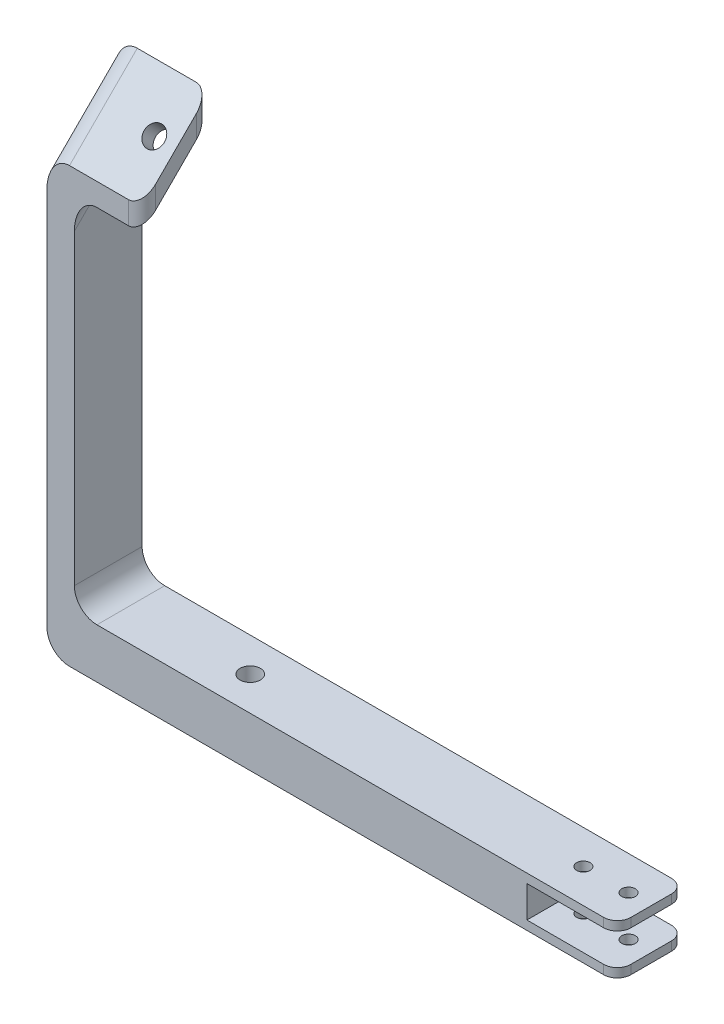
ISO-10303-21;
HEADER;
FILE_DESCRIPTION(('STEP AP214'),'2;1');
FILE_NAME('part.step','',(''),(''),'','','');
FILE_SCHEMA(('AUTOMOTIVE_DESIGN { 1 0 10303 214 1 1 1 1 }'));
ENDSEC;
DATA;
#1=APPLICATION_CONTEXT('core data for automotive mechanical design processes');
#2=APPLICATION_PROTOCOL_DEFINITION('international standard','automotive_design',2000,#1);
#3=PRODUCT_CONTEXT('',#1,'mechanical');
#4=PRODUCT('Part','Part','',(#3));
#5=PRODUCT_RELATED_PRODUCT_CATEGORY('part','',(#4));
#6=PRODUCT_DEFINITION_FORMATION('','',#4);
#7=PRODUCT_DEFINITION_CONTEXT('part definition',#1,'design');
#8=PRODUCT_DEFINITION('design','',#6,#7);
#9=PRODUCT_DEFINITION_SHAPE('','',#8);
#10=(LENGTH_UNIT() NAMED_UNIT(*) SI_UNIT(.MILLI.,.METRE.));
#11=(NAMED_UNIT(*) PLANE_ANGLE_UNIT() SI_UNIT($,.RADIAN.));
#12=(NAMED_UNIT(*) SI_UNIT($,.STERADIAN.) SOLID_ANGLE_UNIT());
#13=UNCERTAINTY_MEASURE_WITH_UNIT(LENGTH_MEASURE(1.E-05),#10,'distance_accuracy_value','');
#14=(GEOMETRIC_REPRESENTATION_CONTEXT(3) GLOBAL_UNCERTAINTY_ASSIGNED_CONTEXT((#13)) GLOBAL_UNIT_ASSIGNED_CONTEXT((#10,
#11,#12)) REPRESENTATION_CONTEXT('',''));
#15=CARTESIAN_POINT('',(0.,0.,0.));
#16=DIRECTION('',(0.,0.,1.));
#17=DIRECTION('',(1.,0.,0.));
#18=AXIS2_PLACEMENT_3D('',#15,#16,#17);
#19=CARTESIAN_POINT('',(-85.18,85.5,7.5));
#20=DIRECTION('',(-1.,0.,0.));
#21=DIRECTION('',(0.,0.,1.));
#22=AXIS2_PLACEMENT_3D('',#19,#20,#21);
#23=PLANE('',#22);
#24=DIRECTION('',(0.,-0.707106781186549,0.707106781186546));
#25=VECTOR('',#24,1.);
#26=CARTESIAN_POINT('',(-85.18,85.5,7.5));
#27=LINE('',#26,#25);
#28=CARTESIAN_POINT('',(-85.18,97.5,-4.5));
#29=VERTEX_POINT('',#28);
#30=CARTESIAN_POINT('',(-85.18,88.5,4.5));
#31=VERTEX_POINT('',#30);
#32=EDGE_CURVE('E207',#29,#31,#27,.T.);
#33=ORIENTED_EDGE('',*,*,#32,.F.);
#34=DIRECTION('',(0.,1.,0.));
#35=VECTOR('',#34,1.);
#36=CARTESIAN_POINT('',(-85.18,105.5,-4.5));
#37=LINE('',#36,#35);
#38=CARTESIAN_POINT('',(-85.18,102.5,-4.5));
#39=VERTEX_POINT('',#38);
#40=EDGE_CURVE('E225',#29,#39,#37,.T.);
#41=ORIENTED_EDGE('',*,*,#40,.T.);
#42=DIRECTION('',(0.,0.707106781186549,-0.707106781186546));
#43=VECTOR('',#42,1.);
#44=CARTESIAN_POINT('',(-85.18,88.,10.));
#45=LINE('',#44,#43);
#46=CARTESIAN_POINT('',(-85.18,93.5,4.5));
#47=VERTEX_POINT('',#46);
#48=EDGE_CURVE('E201',#47,#39,#45,.T.);
#49=ORIENTED_EDGE('',*,*,#48,.F.);
#50=DIRECTION('',(0.,1.,0.));
#51=VECTOR('',#50,1.);
#52=CARTESIAN_POINT('',(-85.18,85.5,4.5));
#53=LINE('',#52,#51);
#54=EDGE_CURVE('E233',#47,#31,#53,.F.);
#55=ORIENTED_EDGE('',*,*,#54,.T.);
#56=EDGE_LOOP('',(#33,#41,#49,#55));
#57=FACE_BOUND('',#56,.T.);
#58=ADVANCED_FACE('F43',(#57),#23,.F.);
#59=CARTESIAN_POINT('',(0.,0.,7.5));
#60=DIRECTION('',(0.,0.,-1.));
#61=DIRECTION('',(-1.,0.,0.));
#62=AXIS2_PLACEMENT_3D('',#59,#60,#61);
#63=PLANE('',#62);
#64=DIRECTION('',(-1.,0.,0.));
#65=VECTOR('',#64,1.);
#66=CARTESIAN_POINT('',(20.,90.5,7.5));
#67=LINE('',#66,#65);
#68=CARTESIAN_POINT('',(-88.18,90.5,7.5));
#69=VERTEX_POINT('',#68);
#70=CARTESIAN_POINT('',(-101.25,90.5,7.5));
#71=VERTEX_POINT('',#70);
#72=EDGE_CURVE('E540',#69,#71,#67,.T.);
#73=ORIENTED_EDGE('',*,*,#72,.T.);
#74=CARTESIAN_POINT('',(-101.25,83.4289321881345,7.5));
#75=DIRECTION('',(0.,0.,-1.));
#76=DIRECTION('',(0.,-1.,0.));
#77=AXIS2_PLACEMENT_3D('',#74,#75,#76);
#78=ELLIPSE('',#77,7.07106781186549,5.);
#79=CARTESIAN_POINT('',(-106.25,83.4289321881345,7.5));
#80=VERTEX_POINT('',#79);
#81=EDGE_CURVE('E278',#71,#80,#78,.F.);
#82=ORIENTED_EDGE('',*,*,#81,.T.);
#83=DIRECTION('',(0.,-1.,0.));
#84=VECTOR('',#83,1.);
#85=CARTESIAN_POINT('',(-106.25,105.5,7.5));
#86=LINE('',#85,#84);
#87=CARTESIAN_POINT('',(-106.25,-0.499999999999973,7.5));
#88=VERTEX_POINT('',#87);
#89=EDGE_CURVE('E325',#80,#88,#86,.T.);
#90=ORIENTED_EDGE('',*,*,#89,.T.);
#91=CARTESIAN_POINT('',(-101.25,-0.499999999999997,7.5));
#92=DIRECTION('',(0.,0.,-1.));
#93=DIRECTION('',(-1.,0.,0.));
#94=AXIS2_PLACEMENT_3D('',#91,#92,#93);
#95=CIRCLE('',#94,5.);
#96=CARTESIAN_POINT('',(-101.25,-5.5,7.5));
#97=VERTEX_POINT('',#96);
#98=EDGE_CURVE('E67',#88,#97,#95,.F.);
#99=ORIENTED_EDGE('',*,*,#98,.T.);
#100=DIRECTION('',(1.,0.,0.));
#101=VECTOR('',#100,1.);
#102=CARTESIAN_POINT('',(-106.25,-5.5,7.5));
#103=LINE('',#102,#101);
#104=CARTESIAN_POINT('',(17.,-5.5,7.5));
#105=VERTEX_POINT('',#104);
#106=EDGE_CURVE('E333',#97,#105,#103,.T.);
#107=ORIENTED_EDGE('',*,*,#106,.T.);
#108=DIRECTION('',(0.,1.,0.));
#109=VECTOR('',#108,1.);
#110=CARTESIAN_POINT('',(17.,0.,7.5));
#111=LINE('',#110,#109);
#112=CARTESIAN_POINT('',(17.,-3.5,7.5));
#113=VERTEX_POINT('',#112);
#114=EDGE_CURVE('E381',#105,#113,#111,.T.);
#115=ORIENTED_EDGE('',*,*,#114,.T.);
#116=DIRECTION('',(-1.,0.,0.));
#117=VECTOR('',#116,1.);
#118=CARTESIAN_POINT('',(20.,-3.5,7.5));
#119=LINE('',#118,#117);
#120=CARTESIAN_POINT('',(0.,-3.5,7.5));
#121=VERTEX_POINT('',#120);
#122=EDGE_CURVE('E355',#113,#121,#119,.T.);
#123=ORIENTED_EDGE('',*,*,#122,.T.);
#124=DIRECTION('',(0.,1.,0.));
#125=VECTOR('',#124,1.);
#126=CARTESIAN_POINT('',(0.,-3.5,7.5));
#127=LINE('',#126,#125);
#128=CARTESIAN_POINT('',(0.,3.5,7.5));
#129=VERTEX_POINT('',#128);
#130=EDGE_CURVE('E483',#121,#129,#127,.T.);
#131=ORIENTED_EDGE('',*,*,#130,.T.);
#132=DIRECTION('',(1.,0.,0.));
#133=VECTOR('',#132,1.);
#134=CARTESIAN_POINT('',(0.,3.5,7.5));
#135=LINE('',#134,#133);
#136=CARTESIAN_POINT('',(17.,3.5,7.5));
#137=VERTEX_POINT('',#136);
#138=EDGE_CURVE('E327',#129,#137,#135,.T.);
#139=ORIENTED_EDGE('',*,*,#138,.T.);
#140=DIRECTION('',(0.,1.,0.));
#141=VECTOR('',#140,1.);
#142=CARTESIAN_POINT('',(17.,0.,7.5));
#143=LINE('',#142,#141);
#144=CARTESIAN_POINT('',(17.,5.5,7.5));
#145=VERTEX_POINT('',#144);
#146=EDGE_CURVE('E378',#137,#145,#143,.T.);
#147=ORIENTED_EDGE('',*,*,#146,.T.);
#148=DIRECTION('',(-1.,0.,0.));
#149=VECTOR('',#148,1.);
#150=CARTESIAN_POINT('',(20.,5.5,7.5));
#151=LINE('',#150,#149);
#152=CARTESIAN_POINT('',(-95.18,5.49999999999999,7.5));
#153=VERTEX_POINT('',#152);
#154=EDGE_CURVE('E315',#145,#153,#151,.T.);
#155=ORIENTED_EDGE('',*,*,#154,.T.);
#156=CARTESIAN_POINT('',(-95.18,10.5,7.5));
#157=DIRECTION('',(0.,0.,-1.));
#158=DIRECTION('',(-1.,0.,0.));
#159=AXIS2_PLACEMENT_3D('',#156,#157,#158);
#160=CIRCLE('',#159,5.);
#161=CARTESIAN_POINT('',(-100.18,10.5,7.5));
#162=VERTEX_POINT('',#161);
#163=EDGE_CURVE('E12',#153,#162,#160,.T.);
#164=ORIENTED_EDGE('',*,*,#163,.T.);
#165=DIRECTION('',(0.,1.,0.));
#166=VECTOR('',#165,1.);
#167=CARTESIAN_POINT('',(-100.18,5.49999999999998,7.5));
#168=LINE('',#167,#166);
#169=CARTESIAN_POINT('',(-100.18,78.4289321881345,7.5));
#170=VERTEX_POINT('',#169);
#171=EDGE_CURVE('E313',#162,#170,#168,.T.);
#172=ORIENTED_EDGE('',*,*,#171,.T.);
#173=CARTESIAN_POINT('',(-95.18,78.4289321881345,7.5));
#174=DIRECTION('',(0.,0.,-1.));
#175=DIRECTION('',(0.,-1.,0.));
#176=AXIS2_PLACEMENT_3D('',#173,#174,#175);
#177=ELLIPSE('',#176,7.07106781186549,5.);
#178=CARTESIAN_POINT('',(-95.18,85.5,7.5));
#179=VERTEX_POINT('',#178);
#180=EDGE_CURVE('E287',#170,#179,#177,.T.);
#181=ORIENTED_EDGE('',*,*,#180,.T.);
#182=DIRECTION('',(1.,0.,0.));
#183=VECTOR('',#182,1.);
#184=CARTESIAN_POINT('',(-100.18,85.5,7.5));
#185=LINE('',#184,#183);
#186=CARTESIAN_POINT('',(-88.18,85.5,7.5));
#187=VERTEX_POINT('',#186);
#188=EDGE_CURVE('E320',#179,#187,#185,.T.);
#189=ORIENTED_EDGE('',*,*,#188,.T.);
#190=DIRECTION('',(0.,1.,0.));
#191=VECTOR('',#190,1.);
#192=CARTESIAN_POINT('',(-88.18,0.,7.5));
#193=LINE('',#192,#191);
#194=EDGE_CURVE('E224',#187,#69,#193,.T.);
#195=ORIENTED_EDGE('',*,*,#194,.T.);
#196=EDGE_LOOP('',(#73,#82,#90,#99,#107,#115,#123,#131,#139,#147,#155,#164,#172,#181,#189,#195));
#197=FACE_BOUND('',#196,.T.);
#198=ADVANCED_FACE('F312',(#197),#63,.F.);
#199=CARTESIAN_POINT('',(0.,0.,-7.5));
#200=DIRECTION('',(0.,0.,-1.));
#201=DIRECTION('',(-1.,0.,0.));
#202=AXIS2_PLACEMENT_3D('',#199,#200,#201);
#203=PLANE('',#202);
#204=DIRECTION('',(0.,-1.,0.));
#205=VECTOR('',#204,1.);
#206=CARTESIAN_POINT('',(-106.25,105.5,-7.5));
#207=LINE('',#206,#205);
#208=CARTESIAN_POINT('',(-106.25,98.4289321881346,-7.5));
#209=VERTEX_POINT('',#208);
#210=CARTESIAN_POINT('',(-106.25,-0.499999999999973,-7.5));
#211=VERTEX_POINT('',#210);
#212=EDGE_CURVE('E217',#209,#211,#207,.T.);
#213=ORIENTED_EDGE('',*,*,#212,.F.);
#214=CARTESIAN_POINT('',(-101.25,98.4289321881346,-7.5));
#215=DIRECTION('',(0.,0.,-1.));
#216=DIRECTION('',(0.,-1.,0.));
#217=AXIS2_PLACEMENT_3D('',#214,#215,#216);
#218=ELLIPSE('',#217,7.07106781186549,5.);
#219=CARTESIAN_POINT('',(-101.25,105.5,-7.5));
#220=VERTEX_POINT('',#219);
#221=EDGE_CURVE('E215',#209,#220,#218,.T.);
#222=ORIENTED_EDGE('',*,*,#221,.T.);
#223=DIRECTION('',(-1.,0.,0.));
#224=VECTOR('',#223,1.);
#225=CARTESIAN_POINT('',(-85.18,105.5,-7.5));
#226=LINE('',#225,#224);
#227=CARTESIAN_POINT('',(-88.18,105.5,-7.49999999999994));
#228=VERTEX_POINT('',#227);
#229=EDGE_CURVE('E198',#228,#220,#226,.T.);
#230=ORIENTED_EDGE('',*,*,#229,.F.);
#231=DIRECTION('',(0.,1.,0.));
#232=VECTOR('',#231,1.);
#233=CARTESIAN_POINT('',(-88.18,85.5,-7.5));
#234=LINE('',#233,#232);
#235=CARTESIAN_POINT('',(-88.18,100.5,-7.5));
#236=VERTEX_POINT('',#235);
#237=EDGE_CURVE('E214',#228,#236,#234,.F.);
#238=ORIENTED_EDGE('',*,*,#237,.T.);
#239=DIRECTION('',(-1.,0.,0.));
#240=VECTOR('',#239,1.);
#241=CARTESIAN_POINT('',(20.,100.5,-7.5));
#242=LINE('',#241,#240);
#243=CARTESIAN_POINT('',(-95.18,100.5,-7.5));
#244=VERTEX_POINT('',#243);
#245=EDGE_CURVE('E249',#236,#244,#242,.T.);
#246=ORIENTED_EDGE('',*,*,#245,.T.);
#247=CARTESIAN_POINT('',(-95.18,93.4289321881346,-7.5));
#248=DIRECTION('',(0.,0.,-1.));
#249=DIRECTION('',(0.,-1.,0.));
#250=AXIS2_PLACEMENT_3D('',#247,#248,#249);
#251=ELLIPSE('',#250,7.07106781186549,5.);
#252=CARTESIAN_POINT('',(-100.18,93.4289321881346,-7.5));
#253=VERTEX_POINT('',#252);
#254=EDGE_CURVE('E290',#244,#253,#251,.F.);
#255=ORIENTED_EDGE('',*,*,#254,.T.);
#256=DIRECTION('',(0.,1.,0.));
#257=VECTOR('',#256,1.);
#258=CARTESIAN_POINT('',(-100.18,5.49999999999998,-7.5));
#259=LINE('',#258,#257);
#260=CARTESIAN_POINT('',(-100.18,10.5,-7.5));
#261=VERTEX_POINT('',#260);
#262=EDGE_CURVE('E218',#261,#253,#259,.T.);
#263=ORIENTED_EDGE('',*,*,#262,.F.);
#264=CARTESIAN_POINT('',(-95.18,10.5,-7.5));
#265=DIRECTION('',(0.,0.,-1.));
#266=DIRECTION('',(-1.,0.,0.));
#267=AXIS2_PLACEMENT_3D('',#264,#265,#266);
#268=CIRCLE('',#267,5.);
#269=CARTESIAN_POINT('',(-95.18,5.49999999999999,-7.5));
#270=VERTEX_POINT('',#269);
#271=EDGE_CURVE('E52',#261,#270,#268,.F.);
#272=ORIENTED_EDGE('',*,*,#271,.T.);
#273=DIRECTION('',(-1.,0.,0.));
#274=VECTOR('',#273,1.);
#275=CARTESIAN_POINT('',(20.,5.5,-7.5));
#276=LINE('',#275,#274);
#277=CARTESIAN_POINT('',(17.,5.5,-7.5));
#278=VERTEX_POINT('',#277);
#279=EDGE_CURVE('E296',#278,#270,#276,.T.);
#280=ORIENTED_EDGE('',*,*,#279,.F.);
#281=DIRECTION('',(0.,1.,0.));
#282=VECTOR('',#281,1.);
#283=CARTESIAN_POINT('',(17.,3.5,-7.5));
#284=LINE('',#283,#282);
#285=CARTESIAN_POINT('',(17.,3.5,-7.5));
#286=VERTEX_POINT('',#285);
#287=EDGE_CURVE('E405',#278,#286,#284,.F.);
#288=ORIENTED_EDGE('',*,*,#287,.T.);
#289=DIRECTION('',(1.,0.,0.));
#290=VECTOR('',#289,1.);
#291=CARTESIAN_POINT('',(0.,3.5,-7.5));
#292=LINE('',#291,#290);
#293=CARTESIAN_POINT('',(0.,3.5,-7.5));
#294=VERTEX_POINT('',#293);
#295=EDGE_CURVE('E305',#294,#286,#292,.T.);
#296=ORIENTED_EDGE('',*,*,#295,.F.);
#297=DIRECTION('',(0.,1.,0.));
#298=VECTOR('',#297,1.);
#299=CARTESIAN_POINT('',(0.,-3.5,-7.5));
#300=LINE('',#299,#298);
#301=CARTESIAN_POINT('',(0.,-3.5,-7.5));
#302=VERTEX_POINT('',#301);
#303=EDGE_CURVE('E340',#302,#294,#300,.T.);
#304=ORIENTED_EDGE('',*,*,#303,.F.);
#305=DIRECTION('',(-1.,0.,0.));
#306=VECTOR('',#305,1.);
#307=CARTESIAN_POINT('',(20.,-3.5,-7.5));
#308=LINE('',#307,#306);
#309=CARTESIAN_POINT('',(17.,-3.5,-7.5));
#310=VERTEX_POINT('',#309);
#311=EDGE_CURVE('E337',#310,#302,#308,.T.);
#312=ORIENTED_EDGE('',*,*,#311,.F.);
#313=DIRECTION('',(0.,1.,0.));
#314=VECTOR('',#313,1.);
#315=CARTESIAN_POINT('',(17.,-5.5,-7.5));
#316=LINE('',#315,#314);
#317=CARTESIAN_POINT('',(17.,-5.5,-7.5));
#318=VERTEX_POINT('',#317);
#319=EDGE_CURVE('E408',#310,#318,#316,.F.);
#320=ORIENTED_EDGE('',*,*,#319,.T.);
#321=DIRECTION('',(1.,0.,0.));
#322=VECTOR('',#321,1.);
#323=CARTESIAN_POINT('',(-106.25,-5.5,-7.5));
#324=LINE('',#323,#322);
#325=CARTESIAN_POINT('',(-101.25,-5.5,-7.5));
#326=VERTEX_POINT('',#325);
#327=EDGE_CURVE('E352',#326,#318,#324,.T.);
#328=ORIENTED_EDGE('',*,*,#327,.F.);
#329=CARTESIAN_POINT('',(-101.25,-0.499999999999997,-7.5));
#330=DIRECTION('',(0.,0.,-1.));
#331=DIRECTION('',(-1.,0.,0.));
#332=AXIS2_PLACEMENT_3D('',#329,#330,#331);
#333=CIRCLE('',#332,5.);
#334=EDGE_CURVE('E268',#326,#211,#333,.T.);
#335=ORIENTED_EDGE('',*,*,#334,.T.);
#336=EDGE_LOOP('',(#213,#222,#230,#238,#246,#255,#263,#272,#280,#288,#296,#304,#312,#320,#328,#335));
#337=FACE_BOUND('',#336,.T.);
#338=ADVANCED_FACE('F212',(#337),#203,.T.);
#339=CARTESIAN_POINT('',(-88.18,85.5,-4.5));
#340=DIRECTION('',(0.,-1.,0.));
#341=DIRECTION('',(0.,0.,-1.));
#342=AXIS2_PLACEMENT_3D('',#339,#340,#341);
#343=CYLINDRICAL_SURFACE('',#342,3.);
#344=ORIENTED_EDGE('',*,*,#40,.F.);
#345=CARTESIAN_POINT('',(-88.18,97.5,-4.5));
#346=DIRECTION('',(0.,-0.707106781186546,-0.707106781186549));
#347=DIRECTION('',(0.,-0.707106781186549,0.707106781186546));
#348=AXIS2_PLACEMENT_3D('',#345,#346,#347);
#349=ELLIPSE('',#348,4.24264068711929,3.);
#350=EDGE_CURVE('E222',#29,#236,#349,.F.);
#351=ORIENTED_EDGE('',*,*,#350,.T.);
#352=ORIENTED_EDGE('',*,*,#237,.F.);
#353=CARTESIAN_POINT('',(-88.18,102.5,-4.5));
#354=DIRECTION('',(0.,0.707106781186546,0.707106781186549));
#355=DIRECTION('',(0.,-0.707106781186549,0.707106781186546));
#356=AXIS2_PLACEMENT_3D('',#353,#354,#355);
#357=ELLIPSE('',#356,4.24264068711929,3.);
#358=EDGE_CURVE('E195',#228,#39,#357,.F.);
#359=ORIENTED_EDGE('',*,*,#358,.T.);
#360=EDGE_LOOP('',(#344,#351,#352,#359));
#361=FACE_BOUND('',#360,.T.);
#362=ADVANCED_FACE('F221',(#361),#343,.T.);
#363=CARTESIAN_POINT('',(-88.18,0.,4.5));
#364=DIRECTION('',(0.,1.,0.));
#365=DIRECTION('',(0.,0.,1.));
#366=AXIS2_PLACEMENT_3D('',#363,#364,#365);
#367=CYLINDRICAL_SURFACE('',#366,3.);
#368=ORIENTED_EDGE('',*,*,#194,.F.);
#369=CARTESIAN_POINT('',(-88.18,88.5,4.5));
#370=DIRECTION('',(0.,-0.707106781186546,-0.707106781186549));
#371=DIRECTION('',(0.,0.707106781186549,-0.707106781186546));
#372=AXIS2_PLACEMENT_3D('',#369,#370,#371);
#373=ELLIPSE('',#372,4.24264068711929,3.);
#374=EDGE_CURVE('E240',#187,#31,#373,.F.);
#375=ORIENTED_EDGE('',*,*,#374,.T.);
#376=ORIENTED_EDGE('',*,*,#54,.F.);
#377=CARTESIAN_POINT('',(-88.18,93.5,4.5));
#378=DIRECTION('',(0.,0.707106781186546,0.707106781186549));
#379=DIRECTION('',(0.,0.707106781186549,-0.707106781186546));
#380=AXIS2_PLACEMENT_3D('',#377,#378,#379);
#381=ELLIPSE('',#380,4.24264068711929,3.);
#382=EDGE_CURVE('E231',#47,#69,#381,.F.);
#383=ORIENTED_EDGE('',*,*,#382,.T.);
#384=EDGE_LOOP('',(#368,#375,#376,#383));
#385=FACE_BOUND('',#384,.T.);
#386=ADVANCED_FACE('F437',(#385),#367,.T.);
#387=CARTESIAN_POINT('',(20.,-3.5,7.5));
#388=DIRECTION('',(0.,-1.,0.));
#389=DIRECTION('',(1.,0.,0.));
#390=AXIS2_PLACEMENT_3D('',#387,#388,#389);
#391=PLANE('',#390);
#392=CARTESIAN_POINT('',(15.,-3.5,0.));
#393=DIRECTION('',(0.,-1.,0.));
#394=DIRECTION('',(1.,0.,0.));
#395=AXIS2_PLACEMENT_3D('',#392,#393,#394);
#396=CIRCLE('',#395,1.5);
#397=CARTESIAN_POINT('',(16.5,-3.5,0.));
#398=VERTEX_POINT('',#397);
#399=EDGE_CURVE('E341',#398,#398,#396,.T.);
#400=ORIENTED_EDGE('',*,*,#399,.T.);
#401=EDGE_LOOP('',(#400));
#402=FACE_BOUND('',#401,.T.);
#403=CARTESIAN_POINT('',(5.,-3.5,0.));
#404=DIRECTION('',(0.,-1.,0.));
#405=DIRECTION('',(1.,0.,0.));
#406=AXIS2_PLACEMENT_3D('',#403,#404,#405);
#407=CIRCLE('',#406,1.5);
#408=CARTESIAN_POINT('',(6.5,-3.5,0.));
#409=VERTEX_POINT('',#408);
#410=EDGE_CURVE('E470',#409,#409,#407,.T.);
#411=ORIENTED_EDGE('',*,*,#410,.T.);
#412=EDGE_LOOP('',(#411));
#413=FACE_BOUND('',#412,.T.);
#414=ORIENTED_EDGE('',*,*,#122,.F.);
#415=CARTESIAN_POINT('',(17.,-3.5,4.5));
#416=DIRECTION('',(0.,-1.,0.));
#417=DIRECTION('',(1.,0.,0.));
#418=AXIS2_PLACEMENT_3D('',#415,#416,#417);
#419=CIRCLE('',#418,3.);
#420=CARTESIAN_POINT('',(20.,-3.5,4.5));
#421=VERTEX_POINT('',#420);
#422=EDGE_CURVE('E388',#113,#421,#419,.F.);
#423=ORIENTED_EDGE('',*,*,#422,.T.);
#424=DIRECTION('',(0.,0.,-1.));
#425=VECTOR('',#424,1.);
#426=CARTESIAN_POINT('',(20.,-3.5,7.5));
#427=LINE('',#426,#425);
#428=CARTESIAN_POINT('',(20.,-3.5,-4.5));
#429=VERTEX_POINT('',#428);
#430=EDGE_CURVE('E336',#421,#429,#427,.T.);
#431=ORIENTED_EDGE('',*,*,#430,.T.);
#432=CARTESIAN_POINT('',(17.,-3.5,-4.5));
#433=DIRECTION('',(0.,-1.,0.));
#434=DIRECTION('',(1.,0.,0.));
#435=AXIS2_PLACEMENT_3D('',#432,#433,#434);
#436=CIRCLE('',#435,3.);
#437=EDGE_CURVE('E385',#429,#310,#436,.F.);
#438=ORIENTED_EDGE('',*,*,#437,.T.);
#439=ORIENTED_EDGE('',*,*,#311,.T.);
#440=DIRECTION('',(0.,0.,-1.));
#441=VECTOR('',#440,1.);
#442=CARTESIAN_POINT('',(0.,-3.5,7.5));
#443=LINE('',#442,#441);
#444=EDGE_CURVE('E374',#121,#302,#443,.T.);
#445=ORIENTED_EDGE('',*,*,#444,.F.);
#446=EDGE_LOOP('',(#414,#423,#431,#438,#439,#445));
#447=FACE_BOUND('',#446,.T.);
#448=ADVANCED_FACE('F595',(#402,#413,#447),#391,.F.);
#449=CARTESIAN_POINT('',(0.,-3.5,7.5));
#450=DIRECTION('',(-1.,0.,0.));
#451=DIRECTION('',(0.,0.,1.));
#452=AXIS2_PLACEMENT_3D('',#449,#450,#451);
#453=PLANE('',#452);
#454=ORIENTED_EDGE('',*,*,#303,.T.);
#455=DIRECTION('',(0.,0.,-1.));
#456=VECTOR('',#455,1.);
#457=CARTESIAN_POINT('',(0.,3.5,7.5));
#458=LINE('',#457,#456);
#459=EDGE_CURVE('E370',#129,#294,#458,.T.);
#460=ORIENTED_EDGE('',*,*,#459,.F.);
#461=ORIENTED_EDGE('',*,*,#130,.F.);
#462=ORIENTED_EDGE('',*,*,#444,.T.);
#463=EDGE_LOOP('',(#454,#460,#461,#462));
#464=FACE_BOUND('',#463,.T.);
#465=ADVANCED_FACE('F509',(#464),#453,.F.);
#466=CARTESIAN_POINT('',(0.,3.5,7.5));
#467=DIRECTION('',(0.,1.,0.));
#468=DIRECTION('',(0.,0.,1.));
#469=AXIS2_PLACEMENT_3D('',#466,#467,#468);
#470=PLANE('',#469);
#471=CARTESIAN_POINT('',(15.,3.5,0.));
#472=DIRECTION('',(0.,1.,0.));
#473=DIRECTION('',(0.,0.,1.));
#474=AXIS2_PLACEMENT_3D('',#471,#472,#473);
#475=CIRCLE('',#474,1.5);
#476=CARTESIAN_POINT('',(15.,3.5,1.5));
#477=VERTEX_POINT('',#476);
#478=EDGE_CURVE('E474',#477,#477,#475,.T.);
#479=ORIENTED_EDGE('',*,*,#478,.T.);
#480=EDGE_LOOP('',(#479));
#481=FACE_BOUND('',#480,.T.);
#482=CARTESIAN_POINT('',(5.,3.5,0.));
#483=DIRECTION('',(0.,1.,0.));
#484=DIRECTION('',(0.,0.,1.));
#485=AXIS2_PLACEMENT_3D('',#482,#483,#484);
#486=CIRCLE('',#485,1.5);
#487=CARTESIAN_POINT('',(5.,3.5,1.5));
#488=VERTEX_POINT('',#487);
#489=EDGE_CURVE('E455',#488,#488,#486,.T.);
#490=ORIENTED_EDGE('',*,*,#489,.T.);
#491=EDGE_LOOP('',(#490));
#492=FACE_BOUND('',#491,.T.);
#493=DIRECTION('',(0.,0.,-1.));
#494=VECTOR('',#493,1.);
#495=CARTESIAN_POINT('',(20.,3.5,7.5));
#496=LINE('',#495,#494);
#497=CARTESIAN_POINT('',(20.,3.5,4.5));
#498=VERTEX_POINT('',#497);
#499=CARTESIAN_POINT('',(20.,3.5,-4.5));
#500=VERTEX_POINT('',#499);
#501=EDGE_CURVE('E366',#498,#500,#496,.T.);
#502=ORIENTED_EDGE('',*,*,#501,.F.);
#503=CARTESIAN_POINT('',(17.,3.5,4.5));
#504=DIRECTION('',(0.,1.,0.));
#505=DIRECTION('',(0.,0.,1.));
#506=AXIS2_PLACEMENT_3D('',#503,#504,#505);
#507=CIRCLE('',#506,3.);
#508=EDGE_CURVE('E427',#498,#137,#507,.F.);
#509=ORIENTED_EDGE('',*,*,#508,.T.);
#510=ORIENTED_EDGE('',*,*,#138,.F.);
#511=ORIENTED_EDGE('',*,*,#459,.T.);
#512=ORIENTED_EDGE('',*,*,#295,.T.);
#513=CARTESIAN_POINT('',(17.,3.5,-4.5));
#514=DIRECTION('',(0.,1.,0.));
#515=DIRECTION('',(0.,0.,1.));
#516=AXIS2_PLACEMENT_3D('',#513,#514,#515);
#517=CIRCLE('',#516,3.);
#518=EDGE_CURVE('E424',#286,#500,#517,.F.);
#519=ORIENTED_EDGE('',*,*,#518,.T.);
#520=EDGE_LOOP('',(#502,#509,#510,#511,#512,#519));
#521=FACE_BOUND('',#520,.T.);
#522=ADVANCED_FACE('F507',(#481,#492,#521),#470,.F.);
#523=CARTESIAN_POINT('',(20.,3.5,7.5));
#524=DIRECTION('',(-1.,0.,0.));
#525=DIRECTION('',(0.,-1.,0.));
#526=AXIS2_PLACEMENT_3D('',#523,#524,#525);
#527=PLANE('',#526);
#528=DIRECTION('',(0.,0.,-1.));
#529=VECTOR('',#528,1.);
#530=CARTESIAN_POINT('',(20.,5.5,7.5));
#531=LINE('',#530,#529);
#532=CARTESIAN_POINT('',(20.,5.5,4.5));
#533=VERTEX_POINT('',#532);
#534=CARTESIAN_POINT('',(20.,5.5,-4.5));
#535=VERTEX_POINT('',#534);
#536=EDGE_CURVE('E363',#533,#535,#531,.T.);
#537=ORIENTED_EDGE('',*,*,#536,.F.);
#538=DIRECTION('',(0.,1.,0.));
#539=VECTOR('',#538,1.);
#540=CARTESIAN_POINT('',(20.,3.5,4.5));
#541=LINE('',#540,#539);
#542=EDGE_CURVE('E421',#533,#498,#541,.F.);
#543=ORIENTED_EDGE('',*,*,#542,.T.);
#544=ORIENTED_EDGE('',*,*,#501,.T.);
#545=DIRECTION('',(0.,1.,0.));
#546=VECTOR('',#545,1.);
#547=CARTESIAN_POINT('',(20.,5.5,-4.5));
#548=LINE('',#547,#546);
#549=EDGE_CURVE('E417',#500,#535,#548,.T.);
#550=ORIENTED_EDGE('',*,*,#549,.T.);
#551=EDGE_LOOP('',(#537,#543,#544,#550));
#552=FACE_BOUND('',#551,.T.);
#553=ADVANCED_FACE('F499',(#552),#527,.F.);
#554=CARTESIAN_POINT('',(20.,5.5,7.5));
#555=DIRECTION('',(0.,-1.,0.));
#556=DIRECTION('',(1.,0.,0.));
#557=AXIS2_PLACEMENT_3D('',#554,#555,#556);
#558=PLANE('',#557);
#559=CARTESIAN_POINT('',(-68.75,5.49999999999999,0.));
#560=DIRECTION('',(0.,1.,0.));
#561=DIRECTION('',(-1.,0.,0.));
#562=AXIS2_PLACEMENT_3D('',#559,#560,#561);
#563=CIRCLE('',#562,2.25);
#564=CARTESIAN_POINT('',(-71.,5.49999999999999,0.));
#565=VERTEX_POINT('',#564);
#566=EDGE_CURVE('E552',#565,#565,#563,.T.);
#567=ORIENTED_EDGE('',*,*,#566,.F.);
#568=EDGE_LOOP('',(#567));
#569=FACE_BOUND('',#568,.T.);
#570=CARTESIAN_POINT('',(15.,5.5,0.));
#571=DIRECTION('',(0.,1.,0.));
#572=DIRECTION('',(-1.,0.,0.));
#573=AXIS2_PLACEMENT_3D('',#570,#571,#572);
#574=CIRCLE('',#573,1.5);
#575=CARTESIAN_POINT('',(13.5,5.5,0.));
#576=VERTEX_POINT('',#575);
#577=EDGE_CURVE('E456',#576,#576,#574,.T.);
#578=ORIENTED_EDGE('',*,*,#577,.F.);
#579=EDGE_LOOP('',(#578));
#580=FACE_BOUND('',#579,.T.);
#581=CARTESIAN_POINT('',(5.,5.5,0.));
#582=DIRECTION('',(0.,1.,0.));
#583=DIRECTION('',(-1.,0.,0.));
#584=AXIS2_PLACEMENT_3D('',#581,#582,#583);
#585=CIRCLE('',#584,1.5);
#586=CARTESIAN_POINT('',(3.5,5.5,0.));
#587=VERTEX_POINT('',#586);
#588=EDGE_CURVE('E460',#587,#587,#585,.T.);
#589=ORIENTED_EDGE('',*,*,#588,.F.);
#590=EDGE_LOOP('',(#589));
#591=FACE_BOUND('',#590,.T.);
#592=ORIENTED_EDGE('',*,*,#279,.T.);
#593=DIRECTION('',(0.,0.,-1.));
#594=VECTOR('',#593,1.);
#595=CARTESIAN_POINT('',(-95.18,5.49999999999999,7.5));
#596=LINE('',#595,#594);
#597=EDGE_CURVE('E59',#270,#153,#596,.F.);
#598=ORIENTED_EDGE('',*,*,#597,.T.);
#599=ORIENTED_EDGE('',*,*,#154,.F.);
#600=CARTESIAN_POINT('',(17.,5.5,4.5));
#601=DIRECTION('',(0.,-1.,0.));
#602=DIRECTION('',(1.,0.,0.));
#603=AXIS2_PLACEMENT_3D('',#600,#601,#602);
#604=CIRCLE('',#603,3.);
#605=EDGE_CURVE('E414',#145,#533,#604,.F.);
#606=ORIENTED_EDGE('',*,*,#605,.T.);
#607=ORIENTED_EDGE('',*,*,#536,.T.);
#608=CARTESIAN_POINT('',(17.,5.5,-4.5));
#609=DIRECTION('',(0.,-1.,0.));
#610=DIRECTION('',(1.,0.,0.));
#611=AXIS2_PLACEMENT_3D('',#608,#609,#610);
#612=CIRCLE('',#611,3.);
#613=EDGE_CURVE('E303',#535,#278,#612,.F.);
#614=ORIENTED_EDGE('',*,*,#613,.T.);
#615=EDGE_LOOP('',(#592,#598,#599,#606,#607,#614));
#616=FACE_BOUND('',#615,.T.);
#617=ADVANCED_FACE('F301',(#569,#580,#591,#616),#558,.F.);
#618=CARTESIAN_POINT('',(-100.18,5.49999999999998,7.5));
#619=DIRECTION('',(-1.,0.,0.));
#620=DIRECTION('',(0.,0.,1.));
#621=AXIS2_PLACEMENT_3D('',#618,#619,#620);
#622=PLANE('',#621);
#623=ORIENTED_EDGE('',*,*,#262,.T.);
#624=DIRECTION('',(0.,-0.707106781186549,0.707106781186546));
#625=VECTOR('',#624,1.);
#626=CARTESIAN_POINT('',(-100.18,41.9644660940671,43.9644660940672));
#627=LINE('',#626,#625);
#628=EDGE_CURVE('E254',#253,#170,#627,.T.);
#629=ORIENTED_EDGE('',*,*,#628,.T.);
#630=ORIENTED_EDGE('',*,*,#171,.F.);
#631=DIRECTION('',(0.,0.,-1.));
#632=VECTOR('',#631,1.);
#633=CARTESIAN_POINT('',(-100.18,10.5,-7.5));
#634=LINE('',#633,#632);
#635=EDGE_CURVE('E244',#162,#261,#634,.T.);
#636=ORIENTED_EDGE('',*,*,#635,.T.);
#637=EDGE_LOOP('',(#623,#629,#630,#636));
#638=FACE_BOUND('',#637,.T.);
#639=ADVANCED_FACE('F317',(#638),#622,.F.);
#640=CARTESIAN_POINT('',(-106.25,105.5,7.5));
#641=DIRECTION('',(1.,0.,0.));
#642=DIRECTION('',(0.,1.,0.));
#643=AXIS2_PLACEMENT_3D('',#640,#641,#642);
#644=PLANE('',#643);
#645=ORIENTED_EDGE('',*,*,#89,.F.);
#646=DIRECTION('',(0.,0.707106781186549,-0.707106781186546));
#647=VECTOR('',#646,1.);
#648=CARTESIAN_POINT('',(-106.25,101.964466094067,-11.0355339059327));
#649=LINE('',#648,#647);
#650=EDGE_CURVE('E264',#80,#209,#649,.T.);
#651=ORIENTED_EDGE('',*,*,#650,.T.);
#652=ORIENTED_EDGE('',*,*,#212,.T.);
#653=DIRECTION('',(0.,0.,-1.));
#654=VECTOR('',#653,1.);
#655=CARTESIAN_POINT('',(-106.25,-0.5,7.5));
#656=LINE('',#655,#654);
#657=EDGE_CURVE('E261',#211,#88,#656,.F.);
#658=ORIENTED_EDGE('',*,*,#657,.T.);
#659=EDGE_LOOP('',(#645,#651,#652,#658));
#660=FACE_BOUND('',#659,.T.);
#661=ADVANCED_FACE('F535',(#660),#644,.F.);
#662=CARTESIAN_POINT('',(-106.25,-5.5,7.5));
#663=DIRECTION('',(0.,1.,0.));
#664=DIRECTION('',(0.,0.,1.));
#665=AXIS2_PLACEMENT_3D('',#662,#663,#664);
#666=PLANE('',#665);
#667=CARTESIAN_POINT('',(15.,-5.5,0.));
#668=DIRECTION('',(0.,1.,0.));
#669=DIRECTION('',(-1.,0.,0.));
#670=AXIS2_PLACEMENT_3D('',#667,#668,#669);
#671=CIRCLE('',#670,1.5);
#672=CARTESIAN_POINT('',(13.5,-5.5,0.));
#673=VERTEX_POINT('',#672);
#674=EDGE_CURVE('E451',#673,#673,#671,.T.);
#675=ORIENTED_EDGE('',*,*,#674,.T.);
#676=EDGE_LOOP('',(#675));
#677=FACE_BOUND('',#676,.T.);
#678=CARTESIAN_POINT('',(5.,-5.5,0.));
#679=DIRECTION('',(0.,1.,0.));
#680=DIRECTION('',(-1.,0.,0.));
#681=AXIS2_PLACEMENT_3D('',#678,#679,#680);
#682=CIRCLE('',#681,1.5);
#683=CARTESIAN_POINT('',(3.5,-5.5,0.));
#684=VERTEX_POINT('',#683);
#685=EDGE_CURVE('E447',#684,#684,#682,.T.);
#686=ORIENTED_EDGE('',*,*,#685,.T.);
#687=EDGE_LOOP('',(#686));
#688=FACE_BOUND('',#687,.T.);
#689=ORIENTED_EDGE('',*,*,#106,.F.);
#690=DIRECTION('',(0.,0.,-1.));
#691=VECTOR('',#690,1.);
#692=CARTESIAN_POINT('',(-101.25,-5.5,7.5));
#693=LINE('',#692,#691);
#694=EDGE_CURVE('E283',#97,#326,#693,.T.);
#695=ORIENTED_EDGE('',*,*,#694,.T.);
#696=ORIENTED_EDGE('',*,*,#327,.T.);
#697=CARTESIAN_POINT('',(17.,-5.5,-4.5));
#698=DIRECTION('',(0.,1.,0.));
#699=DIRECTION('',(0.,0.,1.));
#700=AXIS2_PLACEMENT_3D('',#697,#698,#699);
#701=CIRCLE('',#700,3.);
#702=CARTESIAN_POINT('',(20.,-5.5,-4.5));
#703=VERTEX_POINT('',#702);
#704=EDGE_CURVE('E398',#318,#703,#701,.F.);
#705=ORIENTED_EDGE('',*,*,#704,.T.);
#706=DIRECTION('',(0.,0.,-1.));
#707=VECTOR('',#706,1.);
#708=CARTESIAN_POINT('',(20.,-5.5,7.5));
#709=LINE('',#708,#707);
#710=CARTESIAN_POINT('',(20.,-5.5,4.5));
#711=VERTEX_POINT('',#710);
#712=EDGE_CURVE('E359',#711,#703,#709,.T.);
#713=ORIENTED_EDGE('',*,*,#712,.F.);
#714=CARTESIAN_POINT('',(17.,-5.5,4.5));
#715=DIRECTION('',(0.,1.,0.));
#716=DIRECTION('',(0.,0.,1.));
#717=AXIS2_PLACEMENT_3D('',#714,#715,#716);
#718=CIRCLE('',#717,3.);
#719=EDGE_CURVE('E401',#711,#105,#718,.F.);
#720=ORIENTED_EDGE('',*,*,#719,.T.);
#721=EDGE_LOOP('',(#689,#695,#696,#705,#713,#720));
#722=FACE_BOUND('',#721,.T.);
#723=ADVANCED_FACE('F521',(#677,#688,#722),#666,.F.);
#724=CARTESIAN_POINT('',(20.,-5.5,7.5));
#725=DIRECTION('',(-1.,0.,0.));
#726=DIRECTION('',(0.,0.,1.));
#727=AXIS2_PLACEMENT_3D('',#724,#725,#726);
#728=PLANE('',#727);
#729=ORIENTED_EDGE('',*,*,#430,.F.);
#730=DIRECTION('',(0.,1.,0.));
#731=VECTOR('',#730,1.);
#732=CARTESIAN_POINT('',(20.,-5.5,4.5));
#733=LINE('',#732,#731);
#734=EDGE_CURVE('E395',#421,#711,#733,.F.);
#735=ORIENTED_EDGE('',*,*,#734,.T.);
#736=ORIENTED_EDGE('',*,*,#712,.T.);
#737=DIRECTION('',(0.,1.,0.));
#738=VECTOR('',#737,1.);
#739=CARTESIAN_POINT('',(20.,-3.5,-4.5));
#740=LINE('',#739,#738);
#741=EDGE_CURVE('E391',#703,#429,#740,.T.);
#742=ORIENTED_EDGE('',*,*,#741,.T.);
#743=EDGE_LOOP('',(#729,#735,#736,#742));
#744=FACE_BOUND('',#743,.T.);
#745=ADVANCED_FACE('F525',(#744),#728,.F.);
#746=CARTESIAN_POINT('',(5.,-5.5,0.));
#747=DIRECTION('',(0.,1.,0.));
#748=DIRECTION('',(-1.,0.,0.));
#749=AXIS2_PLACEMENT_3D('',#746,#747,#748);
#750=CYLINDRICAL_SURFACE('',#749,1.5);
#751=ORIENTED_EDGE('',*,*,#685,.F.);
#752=EDGE_LOOP('',(#751));
#753=FACE_BOUND('',#752,.T.);
#754=ORIENTED_EDGE('',*,*,#410,.F.);
#755=EDGE_LOOP('',(#754));
#756=FACE_BOUND('',#755,.T.);
#757=ADVANCED_FACE('F583',(#753,#756),#750,.F.);
#758=CARTESIAN_POINT('',(15.,-5.5,0.));
#759=DIRECTION('',(0.,1.,0.));
#760=DIRECTION('',(-1.,0.,0.));
#761=AXIS2_PLACEMENT_3D('',#758,#759,#760);
#762=CYLINDRICAL_SURFACE('',#761,1.5);
#763=ORIENTED_EDGE('',*,*,#674,.F.);
#764=EDGE_LOOP('',(#763));
#765=FACE_BOUND('',#764,.T.);
#766=ORIENTED_EDGE('',*,*,#399,.F.);
#767=EDGE_LOOP('',(#766));
#768=FACE_BOUND('',#767,.T.);
#769=ADVANCED_FACE('F581',(#765,#768),#762,.F.);
#770=ORIENTED_EDGE('',*,*,#588,.T.);
#771=EDGE_LOOP('',(#770));
#772=FACE_BOUND('',#771,.T.);
#773=ORIENTED_EDGE('',*,*,#489,.F.);
#774=EDGE_LOOP('',(#773));
#775=FACE_BOUND('',#774,.T.);
#776=ADVANCED_FACE('F577',(#772,#775),#750,.F.);
#777=ORIENTED_EDGE('',*,*,#577,.T.);
#778=EDGE_LOOP('',(#777));
#779=FACE_BOUND('',#778,.T.);
#780=ORIENTED_EDGE('',*,*,#478,.F.);
#781=EDGE_LOOP('',(#780));
#782=FACE_BOUND('',#781,.T.);
#783=ADVANCED_FACE('F580',(#779,#782),#762,.F.);
#784=CARTESIAN_POINT('',(17.,0.,4.5));
#785=DIRECTION('',(0.,1.,0.));
#786=DIRECTION('',(0.,0.,1.));
#787=AXIS2_PLACEMENT_3D('',#784,#785,#786);
#788=CYLINDRICAL_SURFACE('',#787,3.);
#789=ORIENTED_EDGE('',*,*,#719,.F.);
#790=ORIENTED_EDGE('',*,*,#734,.F.);
#791=ORIENTED_EDGE('',*,*,#422,.F.);
#792=ORIENTED_EDGE('',*,*,#114,.F.);
#793=EDGE_LOOP('',(#789,#790,#791,#792));
#794=FACE_BOUND('',#793,.T.);
#795=ADVANCED_FACE('F528',(#794),#788,.T.);
#796=CARTESIAN_POINT('',(17.,-5.5,-4.5));
#797=DIRECTION('',(0.,-1.,0.));
#798=DIRECTION('',(0.,0.,-1.));
#799=AXIS2_PLACEMENT_3D('',#796,#797,#798);
#800=CYLINDRICAL_SURFACE('',#799,3.);
#801=ORIENTED_EDGE('',*,*,#704,.F.);
#802=ORIENTED_EDGE('',*,*,#319,.F.);
#803=ORIENTED_EDGE('',*,*,#437,.F.);
#804=ORIENTED_EDGE('',*,*,#741,.F.);
#805=EDGE_LOOP('',(#801,#802,#803,#804));
#806=FACE_BOUND('',#805,.T.);
#807=ADVANCED_FACE('F517',(#806),#800,.T.);
#808=CARTESIAN_POINT('',(17.,0.,4.5));
#809=DIRECTION('',(0.,1.,0.));
#810=DIRECTION('',(-1.,0.,0.));
#811=AXIS2_PLACEMENT_3D('',#808,#809,#810);
#812=CYLINDRICAL_SURFACE('',#811,3.);
#813=ORIENTED_EDGE('',*,*,#508,.F.);
#814=ORIENTED_EDGE('',*,*,#542,.F.);
#815=ORIENTED_EDGE('',*,*,#605,.F.);
#816=ORIENTED_EDGE('',*,*,#146,.F.);
#817=EDGE_LOOP('',(#813,#814,#815,#816));
#818=FACE_BOUND('',#817,.T.);
#819=ADVANCED_FACE('F495',(#818),#812,.T.);
#820=CARTESIAN_POINT('',(17.,3.5,-4.5));
#821=DIRECTION('',(0.,-1.,0.));
#822=DIRECTION('',(1.,0.,0.));
#823=AXIS2_PLACEMENT_3D('',#820,#821,#822);
#824=CYLINDRICAL_SURFACE('',#823,3.);
#825=ORIENTED_EDGE('',*,*,#518,.F.);
#826=ORIENTED_EDGE('',*,*,#287,.F.);
#827=ORIENTED_EDGE('',*,*,#613,.F.);
#828=ORIENTED_EDGE('',*,*,#549,.F.);
#829=EDGE_LOOP('',(#825,#826,#827,#828));
#830=FACE_BOUND('',#829,.T.);
#831=ADVANCED_FACE('F504',(#830),#824,.T.);
#832=CARTESIAN_POINT('',(20.,90.5,7.5));
#833=DIRECTION('',(0.,0.707106781186546,0.707106781186549));
#834=DIRECTION('',(0.,-0.707106781186549,0.707106781186546));
#835=AXIS2_PLACEMENT_3D('',#832,#833,#834);
#836=PLANE('',#835);
#837=CARTESIAN_POINT('',(-89.98,98.,0.));
#838=DIRECTION('',(0.,0.707106781186546,0.707106781186549));
#839=DIRECTION('',(0.,-0.707106781186549,0.707106781186546));
#840=AXIS2_PLACEMENT_3D('',#837,#838,#839);
#841=CIRCLE('',#840,2.25);
#842=CARTESIAN_POINT('',(-89.98,96.4090097423303,1.59099025766971));
#843=VERTEX_POINT('',#842);
#844=EDGE_CURVE('E250',#843,#843,#841,.T.);
#845=ORIENTED_EDGE('',*,*,#844,.F.);
#846=EDGE_LOOP('',(#845));
#847=FACE_BOUND('',#846,.T.);
#848=ORIENTED_EDGE('',*,*,#229,.T.);
#849=DIRECTION('',(0.,0.707106781186549,-0.707106781186546));
#850=VECTOR('',#849,1.);
#851=CARTESIAN_POINT('',(-101.25,90.5,7.5));
#852=LINE('',#851,#850);
#853=EDGE_CURVE('E273',#220,#71,#852,.F.);
#854=ORIENTED_EDGE('',*,*,#853,.T.);
#855=ORIENTED_EDGE('',*,*,#72,.F.);
#856=ORIENTED_EDGE('',*,*,#382,.F.);
#857=ORIENTED_EDGE('',*,*,#48,.T.);
#858=ORIENTED_EDGE('',*,*,#358,.F.);
#859=EDGE_LOOP('',(#848,#854,#855,#856,#857,#858));
#860=FACE_BOUND('',#859,.T.);
#861=ADVANCED_FACE('F197',(#847,#860),#836,.T.);
#862=CARTESIAN_POINT('',(20.,85.5,7.5));
#863=DIRECTION('',(0.,-0.707106781186546,-0.707106781186549));
#864=DIRECTION('',(0.,0.707106781186549,-0.707106781186546));
#865=AXIS2_PLACEMENT_3D('',#862,#863,#864);
#866=PLANE('',#865);
#867=CARTESIAN_POINT('',(-89.98,95.5000000000001,-2.50000000000002));
#868=DIRECTION('',(0.,-0.707106781186546,-0.707106781186549));
#869=DIRECTION('',(0.,0.707106781186549,-0.707106781186546));
#870=AXIS2_PLACEMENT_3D('',#867,#868,#869);
#871=CIRCLE('',#870,2.25);
#872=CARTESIAN_POINT('',(-89.98,97.0909902576698,-4.09099025766974));
#873=VERTEX_POINT('',#872);
#874=EDGE_CURVE('E245',#873,#873,#871,.T.);
#875=ORIENTED_EDGE('',*,*,#874,.F.);
#876=EDGE_LOOP('',(#875));
#877=FACE_BOUND('',#876,.T.);
#878=ORIENTED_EDGE('',*,*,#188,.F.);
#879=DIRECTION('',(0.,-0.707106781186549,0.707106781186546));
#880=VECTOR('',#879,1.);
#881=CARTESIAN_POINT('',(-95.18,85.5,7.5));
#882=LINE('',#881,#880);
#883=EDGE_CURVE('E258',#179,#244,#882,.F.);
#884=ORIENTED_EDGE('',*,*,#883,.T.);
#885=ORIENTED_EDGE('',*,*,#245,.F.);
#886=ORIENTED_EDGE('',*,*,#350,.F.);
#887=ORIENTED_EDGE('',*,*,#32,.T.);
#888=ORIENTED_EDGE('',*,*,#374,.F.);
#889=EDGE_LOOP('',(#878,#884,#885,#886,#887,#888));
#890=FACE_BOUND('',#889,.T.);
#891=ADVANCED_FACE('F441',(#877,#890),#866,.T.);
#892=CARTESIAN_POINT('',(-89.98,42.5000000000002,-55.5));
#893=DIRECTION('',(0.,0.707106781186546,0.707106781186549));
#894=DIRECTION('',(0.,-0.707106781186549,0.707106781186546));
#895=AXIS2_PLACEMENT_3D('',#892,#893,#894);
#896=CYLINDRICAL_SURFACE('',#895,2.25);
#897=ORIENTED_EDGE('',*,*,#874,.T.);
#898=EDGE_LOOP('',(#897));
#899=FACE_BOUND('',#898,.T.);
#900=ORIENTED_EDGE('',*,*,#844,.T.);
#901=EDGE_LOOP('',(#900));
#902=FACE_BOUND('',#901,.T.);
#903=ADVANCED_FACE('F566',(#899,#902),#896,.F.);
#904=CARTESIAN_POINT('',(-68.75,-1.50000000000001,0.));
#905=DIRECTION('',(0.,1.,0.));
#906=DIRECTION('',(-1.,0.,0.));
#907=AXIS2_PLACEMENT_3D('',#904,#905,#906);
#908=CYLINDRICAL_SURFACE('',#907,2.25);
#909=CARTESIAN_POINT('',(-68.75,-1.50000000000001,0.));
#910=DIRECTION('',(0.,1.,0.));
#911=DIRECTION('',(-1.,0.,0.));
#912=AXIS2_PLACEMENT_3D('',#909,#910,#911);
#913=CIRCLE('',#912,2.25);
#914=CARTESIAN_POINT('',(-71.,-1.50000000000001,0.));
#915=VERTEX_POINT('',#914);
#916=EDGE_CURVE('E551',#915,#915,#913,.T.);
#917=CARTESIAN_POINT('',(-71.,-1.50000000000001,0.));
#918=CARTESIAN_POINT('',(-71.,-1.42708333333334,0.));
#919=CARTESIAN_POINT('',(-71.,-1.35416666666668,0.));
#920=CARTESIAN_POINT('',(-71.,-1.20833333333334,0.));
#921=CARTESIAN_POINT('',(-71.,-1.13541666666668,0.));
#922=CARTESIAN_POINT('',(-71.,-0.989583333333345,0.));
#923=CARTESIAN_POINT('',(-71.,-0.916666666666678,0.));
#924=CARTESIAN_POINT('',(-71.,-0.770833333333345,0.));
#925=CARTESIAN_POINT('',(-71.,-0.697916666666678,0.));
#926=CARTESIAN_POINT('',(-71.,-0.552083333333345,0.));
#927=CARTESIAN_POINT('',(-71.,-0.479166666666678,0.));
#928=CARTESIAN_POINT('',(-71.,-0.333333333333345,0.));
#929=CARTESIAN_POINT('',(-71.,-0.260416666666678,0.));
#930=CARTESIAN_POINT('',(-71.,-0.114583333333345,0.));
#931=CARTESIAN_POINT('',(-71.,-0.0416666666666781,0.));
#932=CARTESIAN_POINT('',(-71.,0.104166666666655,0.));
#933=CARTESIAN_POINT('',(-71.,0.177083333333322,0.));
#934=CARTESIAN_POINT('',(-71.,0.322916666666655,0.));
#935=CARTESIAN_POINT('',(-71.,0.395833333333322,0.));
#936=CARTESIAN_POINT('',(-71.,0.541666666666655,0.));
#937=CARTESIAN_POINT('',(-71.,0.614583333333322,0.));
#938=CARTESIAN_POINT('',(-71.,0.760416666666655,0.));
#939=CARTESIAN_POINT('',(-71.,0.833333333333321,0.));
#940=CARTESIAN_POINT('',(-71.,0.979166666666655,0.));
#941=CARTESIAN_POINT('',(-71.,1.05208333333332,0.));
#942=CARTESIAN_POINT('',(-71.,1.19791666666665,0.));
#943=CARTESIAN_POINT('',(-71.,1.27083333333332,0.));
#944=CARTESIAN_POINT('',(-71.,1.41666666666665,0.));
#945=CARTESIAN_POINT('',(-71.,1.48958333333332,0.));
#946=CARTESIAN_POINT('',(-71.,1.63541666666665,0.));
#947=CARTESIAN_POINT('',(-71.,1.70833333333332,0.));
#948=CARTESIAN_POINT('',(-71.,1.85416666666665,0.));
#949=CARTESIAN_POINT('',(-71.,1.92708333333332,0.));
#950=CARTESIAN_POINT('',(-71.,2.07291666666665,0.));
#951=CARTESIAN_POINT('',(-71.,2.14583333333332,0.));
#952=CARTESIAN_POINT('',(-71.,2.29166666666665,0.));
#953=CARTESIAN_POINT('',(-71.,2.36458333333332,0.));
#954=CARTESIAN_POINT('',(-71.,2.51041666666665,0.));
#955=CARTESIAN_POINT('',(-71.,2.58333333333332,0.));
#956=CARTESIAN_POINT('',(-71.,2.72916666666665,0.));
#957=CARTESIAN_POINT('',(-71.,2.80208333333332,0.));
#958=CARTESIAN_POINT('',(-71.,2.94791666666665,0.));
#959=CARTESIAN_POINT('',(-71.,3.02083333333332,0.));
#960=CARTESIAN_POINT('',(-71.,3.16666666666665,0.));
#961=CARTESIAN_POINT('',(-71.,3.23958333333332,0.));
#962=CARTESIAN_POINT('',(-71.,3.38541666666665,0.));
#963=CARTESIAN_POINT('',(-71.,3.45833333333332,0.));
#964=CARTESIAN_POINT('',(-71.,3.60416666666665,0.));
#965=CARTESIAN_POINT('',(-71.,3.67708333333332,0.));
#966=CARTESIAN_POINT('',(-71.,3.82291666666665,0.));
#967=CARTESIAN_POINT('',(-71.,3.89583333333332,0.));
#968=CARTESIAN_POINT('',(-71.,4.04166666666665,0.));
#969=CARTESIAN_POINT('',(-71.,4.11458333333332,0.));
#970=CARTESIAN_POINT('',(-71.,4.26041666666665,0.));
#971=CARTESIAN_POINT('',(-71.,4.33333333333332,0.));
#972=CARTESIAN_POINT('',(-71.,4.47916666666665,0.));
#973=CARTESIAN_POINT('',(-71.,4.55208333333332,0.));
#974=CARTESIAN_POINT('',(-71.,4.69791666666665,0.));
#975=CARTESIAN_POINT('',(-71.,4.77083333333332,0.));
#976=CARTESIAN_POINT('',(-71.,4.91666666666665,0.));
#977=CARTESIAN_POINT('',(-71.,4.98958333333332,0.));
#978=CARTESIAN_POINT('',(-71.,5.13541666666665,0.));
#979=CARTESIAN_POINT('',(-71.,5.20833333333332,0.));
#980=CARTESIAN_POINT('',(-71.,5.35416666666665,0.));
#981=CARTESIAN_POINT('',(-71.,5.42708333333332,0.));
#982=CARTESIAN_POINT('',(-71.,5.49999999999999,0.));
#983=B_SPLINE_CURVE_WITH_KNOTS('',3,(#917,#918,#919,#920,#921,#922,#923,#924,#925,#926,#927,
#928,#929,#930,#931,#932,#933,#934,#935,#936,#937,#938,#939,#940,#941,#942,#943,#944,#945,#946,
#947,#948,#949,#950,#951,#952,#953,#954,#955,#956,#957,#958,#959,#960,#961,#962,#963,#964,#965,
#966,#967,#968,#969,#970,#971,#972,#973,#974,#975,#976,#977,#978,#979,#980,#981,#982),
.UNSPECIFIED.,.F.,.F.,(4,2,2,2,2,2,2,2,2,2,2,2,2,2,2,2,2,2,2,2,2,2,2,2,2,2,2,2,2,2,2,2,4),(0.,
0.21875,0.4375,0.65625,0.875,1.09375,1.3125,1.53125,1.75,1.96875,2.1875,2.40625,2.625,2.84375,
3.0625,3.28125,3.5,3.71875,3.9375,4.15625,4.375,4.59375,4.8125,5.03125,5.25,5.46875,5.6875,
5.90625,6.125,6.34375,6.5625,6.78125,7.),.UNSPECIFIED.);
#984=EDGE_CURVE('BSEAM563',#915,#565,#983,.T.);
#985=ORIENTED_EDGE('',*,*,#916,.F.);
#986=ORIENTED_EDGE('',*,*,#566,.T.);
#987=ORIENTED_EDGE('',*,*,#984,.T.);
#988=ORIENTED_EDGE('',*,*,#984,.F.);
#989=EDGE_LOOP('',(#985,#987,#986,#988));
#990=FACE_BOUND('',#989,.T.);
#991=ADVANCED_FACE('F563',(#990),#908,.F.);
#992=CARTESIAN_POINT('',(-68.75,-1.50000000000001,0.));
#993=DIRECTION('',(0.,1.,0.));
#994=DIRECTION('',(-1.,0.,0.));
#995=AXIS2_PLACEMENT_3D('',#992,#993,#994);
#996=PLANE('',#995);
#997=ORIENTED_EDGE('',*,*,#916,.T.);
#998=EDGE_LOOP('',(#997));
#999=FACE_BOUND('',#998,.T.);
#1000=ADVANCED_FACE('F561',(#999),#996,.T.);
#1001=CARTESIAN_POINT('',(-95.18,41.9644660940671,43.9644660940673));
#1002=DIRECTION('',(0.,-0.707106781186549,0.707106781186546));
#1003=DIRECTION('',(0.,-0.707106781186546,-0.707106781186549));
#1004=AXIS2_PLACEMENT_3D('',#1001,#1002,#1003);
#1005=CYLINDRICAL_SURFACE('',#1004,5.);
#1006=ORIENTED_EDGE('',*,*,#254,.F.);
#1007=ORIENTED_EDGE('',*,*,#883,.F.);
#1008=ORIENTED_EDGE('',*,*,#180,.F.);
#1009=ORIENTED_EDGE('',*,*,#628,.F.);
#1010=EDGE_LOOP('',(#1006,#1007,#1008,#1009));
#1011=FACE_BOUND('',#1010,.T.);
#1012=ADVANCED_FACE('F639',(#1011),#1005,.F.);
#1013=CARTESIAN_POINT('',(-101.25,94.4644660940673,-3.53553390593274));
#1014=DIRECTION('',(0.,-0.707106781186549,0.707106781186546));
#1015=DIRECTION('',(0.,-0.707106781186546,-0.707106781186549));
#1016=AXIS2_PLACEMENT_3D('',#1013,#1014,#1015);
#1017=CYLINDRICAL_SURFACE('',#1016,5.);
#1018=ORIENTED_EDGE('',*,*,#81,.F.);
#1019=ORIENTED_EDGE('',*,*,#853,.F.);
#1020=ORIENTED_EDGE('',*,*,#221,.F.);
#1021=ORIENTED_EDGE('',*,*,#650,.F.);
#1022=EDGE_LOOP('',(#1018,#1019,#1020,#1021));
#1023=FACE_BOUND('',#1022,.T.);
#1024=ADVANCED_FACE('F539',(#1023),#1017,.T.);
#1025=CARTESIAN_POINT('',(-95.18,10.5,7.5));
#1026=DIRECTION('',(0.,0.,1.));
#1027=DIRECTION('',(1.,0.,0.));
#1028=AXIS2_PLACEMENT_3D('',#1025,#1026,#1027);
#1029=CYLINDRICAL_SURFACE('',#1028,5.);
#1030=ORIENTED_EDGE('',*,*,#163,.F.);
#1031=ORIENTED_EDGE('',*,*,#597,.F.);
#1032=ORIENTED_EDGE('',*,*,#271,.F.);
#1033=ORIENTED_EDGE('',*,*,#635,.F.);
#1034=EDGE_LOOP('',(#1030,#1031,#1032,#1033));
#1035=FACE_BOUND('',#1034,.T.);
#1036=ADVANCED_FACE('F308',(#1035),#1029,.F.);
#1037=CARTESIAN_POINT('',(-101.25,-0.499999999999997,7.5));
#1038=DIRECTION('',(0.,0.,-1.));
#1039=DIRECTION('',(-1.,0.,0.));
#1040=AXIS2_PLACEMENT_3D('',#1037,#1038,#1039);
#1041=CYLINDRICAL_SURFACE('',#1040,5.);
#1042=ORIENTED_EDGE('',*,*,#98,.F.);
#1043=ORIENTED_EDGE('',*,*,#657,.F.);
#1044=ORIENTED_EDGE('',*,*,#334,.F.);
#1045=ORIENTED_EDGE('',*,*,#694,.F.);
#1046=EDGE_LOOP('',(#1042,#1043,#1044,#1045));
#1047=FACE_BOUND('',#1046,.T.);
#1048=ADVANCED_FACE('F45',(#1047),#1041,.T.);
#1049=CLOSED_SHELL('',(#58,#198,#338,#362,#386,#448,#465,#522,#553,#617,#639,#661,#723,#745,
#757,#769,#776,#783,#795,#807,#819,#831,#861,#891,#903,#991,#1000,#1012,#1024,#1036,#1048));
#1050=MANIFOLD_SOLID_BREP('B2',#1049);
#1051=ADVANCED_BREP_SHAPE_REPRESENTATION('',(#18,#1050),#14);
#1052=SHAPE_DEFINITION_REPRESENTATION(#9,#1051);
ENDSEC;
END-ISO-10303-21;
